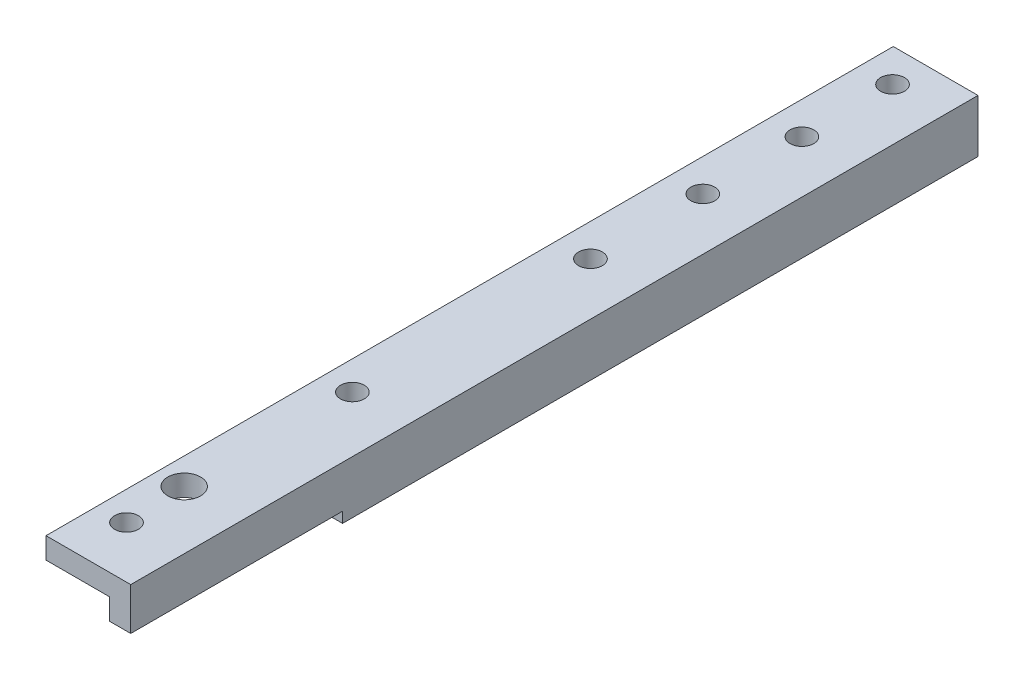
ISO-10303-21;
HEADER;
FILE_DESCRIPTION(('STEP AP214'),'2;1');
FILE_NAME('part.step','',(''),(''),'','','');
FILE_SCHEMA(('AUTOMOTIVE_DESIGN { 1 0 10303 214 1 1 1 1 }'));
ENDSEC;
DATA;
#1=APPLICATION_CONTEXT('core data for automotive mechanical design processes');
#2=APPLICATION_PROTOCOL_DEFINITION('international standard','automotive_design',2000,#1);
#3=PRODUCT_CONTEXT('',#1,'mechanical');
#4=PRODUCT('Part','Part','',(#3));
#5=PRODUCT_RELATED_PRODUCT_CATEGORY('part','',(#4));
#6=PRODUCT_DEFINITION_FORMATION('','',#4);
#7=PRODUCT_DEFINITION_CONTEXT('part definition',#1,'design');
#8=PRODUCT_DEFINITION('design','',#6,#7);
#9=PRODUCT_DEFINITION_SHAPE('','',#8);
#10=(LENGTH_UNIT() NAMED_UNIT(*) SI_UNIT(.MILLI.,.METRE.));
#11=(NAMED_UNIT(*) PLANE_ANGLE_UNIT() SI_UNIT($,.RADIAN.));
#12=(NAMED_UNIT(*) SI_UNIT($,.STERADIAN.) SOLID_ANGLE_UNIT());
#13=UNCERTAINTY_MEASURE_WITH_UNIT(LENGTH_MEASURE(1.E-05),#10,'distance_accuracy_value','');
#14=(GEOMETRIC_REPRESENTATION_CONTEXT(3) GLOBAL_UNCERTAINTY_ASSIGNED_CONTEXT((#13)) GLOBAL_UNIT_ASSIGNED_CONTEXT((#10,
#11,#12)) REPRESENTATION_CONTEXT('',''));
#15=CARTESIAN_POINT('',(0.,0.,0.));
#16=DIRECTION('',(0.,0.,1.));
#17=DIRECTION('',(1.,0.,0.));
#18=AXIS2_PLACEMENT_3D('',#15,#16,#17);
#19=CARTESIAN_POINT('',(4.,-4.,160.));
#20=DIRECTION('',(0.,1.,0.));
#21=DIRECTION('',(0.,0.,1.));
#22=AXIS2_PLACEMENT_3D('',#19,#20,#21);
#23=PLANE('',#22);
#24=CARTESIAN_POINT('',(9.00000000001513,-4.,138.89793195105));
#25=DIRECTION('',(0.,-1.,0.));
#26=DIRECTION('',(0.,0.,-1.));
#27=AXIS2_PLACEMENT_3D('',#24,#25,#26);
#28=CIRCLE('',#27,3.1);
#29=CARTESIAN_POINT('',(9.00000000001513,-4.,135.79793195105));
#30=VERTEX_POINT('',#29);
#31=EDGE_CURVE('E204',#30,#30,#28,.T.);
#32=ORIENTED_EDGE('',*,*,#31,.F.);
#33=EDGE_LOOP('',(#32));
#34=FACE_BOUND('',#33,.T.);
#35=CARTESIAN_POINT('',(10.1289115033545,-4.,6.26728637477271));
#36=DIRECTION('',(0.,-1.,0.));
#37=DIRECTION('',(0.,0.,-1.));
#38=AXIS2_PLACEMENT_3D('',#35,#36,#37);
#39=CIRCLE('',#38,2.24999999999999);
#40=CARTESIAN_POINT('',(10.1289115033545,-4.,4.01728637477273));
#41=VERTEX_POINT('',#40);
#42=EDGE_CURVE('E201',#41,#41,#39,.T.);
#43=ORIENTED_EDGE('',*,*,#42,.F.);
#44=EDGE_LOOP('',(#43));
#45=FACE_BOUND('',#44,.T.);
#46=CARTESIAN_POINT('',(10.1289115033545,-4.,23.3815670297532));
#47=DIRECTION('',(0.,-1.,0.));
#48=DIRECTION('',(0.,0.,-1.));
#49=AXIS2_PLACEMENT_3D('',#46,#47,#48);
#50=CIRCLE('',#49,2.24999999999999);
#51=CARTESIAN_POINT('',(10.1289115033545,-4.,21.1315670297532));
#52=VERTEX_POINT('',#51);
#53=EDGE_CURVE('E195',#52,#52,#50,.T.);
#54=ORIENTED_EDGE('',*,*,#53,.F.);
#55=EDGE_LOOP('',(#54));
#56=FACE_BOUND('',#55,.T.);
#57=CARTESIAN_POINT('',(10.1289115033545,-4.,42.0931805458651));
#58=DIRECTION('',(0.,-1.,0.));
#59=DIRECTION('',(0.,0.,-1.));
#60=AXIS2_PLACEMENT_3D('',#57,#58,#59);
#61=CIRCLE('',#60,2.24999999999999);
#62=CARTESIAN_POINT('',(10.1289115033545,-4.,39.8431805458652));
#63=VERTEX_POINT('',#62);
#64=EDGE_CURVE('E189',#63,#63,#61,.T.);
#65=ORIENTED_EDGE('',*,*,#64,.F.);
#66=EDGE_LOOP('',(#65));
#67=FACE_BOUND('',#66,.T.);
#68=CARTESIAN_POINT('',(10.1289115033545,-4.,63.3148885580409));
#69=DIRECTION('',(0.,-1.,0.));
#70=DIRECTION('',(0.,0.,-1.));
#71=AXIS2_PLACEMENT_3D('',#68,#69,#70);
#72=CIRCLE('',#71,2.24999999999999);
#73=CARTESIAN_POINT('',(10.1289115033545,-4.,61.0648885580409));
#74=VERTEX_POINT('',#73);
#75=EDGE_CURVE('E183',#74,#74,#72,.T.);
#76=ORIENTED_EDGE('',*,*,#75,.F.);
#77=EDGE_LOOP('',(#76));
#78=FACE_BOUND('',#77,.T.);
#79=CARTESIAN_POINT('',(9.44434027715525,-4.,107.583827852257));
#80=DIRECTION('',(0.,-1.,0.));
#81=DIRECTION('',(0.,0.,-1.));
#82=AXIS2_PLACEMENT_3D('',#79,#80,#81);
#83=CIRCLE('',#82,2.24999999999999);
#84=CARTESIAN_POINT('',(9.44434027715525,-4.,105.333827852257));
#85=VERTEX_POINT('',#84);
#86=EDGE_CURVE('E177',#85,#85,#83,.T.);
#87=ORIENTED_EDGE('',*,*,#86,.F.);
#88=EDGE_LOOP('',(#87));
#89=FACE_BOUND('',#88,.T.);
#90=DIRECTION('',(1.,0.,0.));
#91=VECTOR('',#90,1.);
#92=CARTESIAN_POINT('',(4.,-4.,0.));
#93=LINE('',#92,#91);
#94=CARTESIAN_POINT('',(4.,-4.,0.));
#95=VERTEX_POINT('',#94);
#96=CARTESIAN_POINT('',(16.,-4.,0.));
#97=VERTEX_POINT('',#96);
#98=EDGE_CURVE('E86',#95,#97,#93,.T.);
#99=ORIENTED_EDGE('',*,*,#98,.T.);
#100=DIRECTION('',(0.,0.,-1.));
#101=VECTOR('',#100,1.);
#102=CARTESIAN_POINT('',(16.,-4.,160.));
#103=LINE('',#102,#101);
#104=CARTESIAN_POINT('',(16.,-4.,160.));
#105=VERTEX_POINT('',#104);
#106=EDGE_CURVE('E141',#105,#97,#103,.T.);
#107=ORIENTED_EDGE('',*,*,#106,.F.);
#108=DIRECTION('',(1.,0.,0.));
#109=VECTOR('',#108,1.);
#110=CARTESIAN_POINT('',(4.,-4.,160.));
#111=LINE('',#110,#109);
#112=CARTESIAN_POINT('',(4.,-4.,160.));
#113=VERTEX_POINT('',#112);
#114=EDGE_CURVE('E60',#113,#105,#111,.T.);
#115=ORIENTED_EDGE('',*,*,#114,.F.);
#116=DIRECTION('',(0.,0.,-1.));
#117=VECTOR('',#116,1.);
#118=CARTESIAN_POINT('',(4.,-4.,160.));
#119=LINE('',#118,#117);
#120=EDGE_CURVE('E139',#113,#95,#119,.T.);
#121=ORIENTED_EDGE('',*,*,#120,.T.);
#122=EDGE_LOOP('',(#99,#107,#115,#121));
#123=FACE_BOUND('',#122,.T.);
#124=CARTESIAN_POINT('',(9.44434027715525,-4.,150.244789298313));
#125=DIRECTION('',(0.,-1.,0.));
#126=DIRECTION('',(0.,0.,-1.));
#127=AXIS2_PLACEMENT_3D('',#124,#125,#126);
#128=CIRCLE('',#127,2.24999999999999);
#129=CARTESIAN_POINT('',(9.44434027715525,-4.,147.994789298313));
#130=VERTEX_POINT('',#129);
#131=EDGE_CURVE('E171',#130,#130,#128,.T.);
#132=ORIENTED_EDGE('',*,*,#131,.F.);
#133=EDGE_LOOP('',(#132));
#134=FACE_BOUND('',#133,.T.);
#135=ADVANCED_FACE('F35',(#34,#45,#56,#67,#78,#89,#123,#134),#23,.F.);
#136=CARTESIAN_POINT('',(16.,-4.,160.));
#137=DIRECTION('',(1.,0.,0.));
#138=DIRECTION('',(0.,0.,-1.));
#139=AXIS2_PLACEMENT_3D('',#136,#137,#138);
#140=PLANE('',#139);
#141=DIRECTION('',(0.,-1.,0.));
#142=VECTOR('',#141,1.);
#143=CARTESIAN_POINT('',(16.,-9.99999999999998,120.));
#144=LINE('',#143,#142);
#145=CARTESIAN_POINT('',(16.,-8.00000000000024,120.));
#146=VERTEX_POINT('',#145);
#147=CARTESIAN_POINT('',(16.,-10.,120.));
#148=VERTEX_POINT('',#147);
#149=EDGE_CURVE('E115',#146,#148,#144,.T.);
#150=ORIENTED_EDGE('',*,*,#149,.F.);
#151=DIRECTION('',(0.,0.,-1.));
#152=VECTOR('',#151,1.);
#153=CARTESIAN_POINT('',(16.,-8.00000000000026,120.));
#154=LINE('',#153,#152);
#155=CARTESIAN_POINT('',(16.,-8.00000000000026,160.));
#156=VERTEX_POINT('',#155);
#157=EDGE_CURVE('E155',#156,#146,#154,.T.);
#158=ORIENTED_EDGE('',*,*,#157,.F.);
#159=DIRECTION('',(0.,-1.,0.));
#160=VECTOR('',#159,1.);
#161=CARTESIAN_POINT('',(16.,-4.,160.));
#162=LINE('',#161,#160);
#163=EDGE_CURVE('E144',#105,#156,#162,.T.);
#164=ORIENTED_EDGE('',*,*,#163,.F.);
#165=ORIENTED_EDGE('',*,*,#106,.T.);
#166=DIRECTION('',(0.,-1.,0.));
#167=VECTOR('',#166,1.);
#168=CARTESIAN_POINT('',(16.,-4.,0.));
#169=LINE('',#168,#167);
#170=CARTESIAN_POINT('',(16.,-10.,0.));
#171=VERTEX_POINT('',#170);
#172=EDGE_CURVE('E152',#97,#171,#169,.T.);
#173=ORIENTED_EDGE('',*,*,#172,.T.);
#174=DIRECTION('',(0.,0.,-1.));
#175=VECTOR('',#174,1.);
#176=CARTESIAN_POINT('',(16.,-10.,160.));
#177=LINE('',#176,#175);
#178=EDGE_CURVE('E11',#148,#171,#177,.T.);
#179=ORIENTED_EDGE('',*,*,#178,.F.);
#180=EDGE_LOOP('',(#150,#158,#164,#165,#173,#179));
#181=FACE_BOUND('',#180,.T.);
#182=ADVANCED_FACE('F37',(#181),#140,.F.);
#183=CARTESIAN_POINT('',(16.,-10.,160.));
#184=DIRECTION('',(0.,1.,0.));
#185=DIRECTION('',(0.,0.,1.));
#186=AXIS2_PLACEMENT_3D('',#183,#184,#185);
#187=PLANE('',#186);
#188=DIRECTION('',(0.,0.,-1.));
#189=VECTOR('',#188,1.);
#190=CARTESIAN_POINT('',(20.,-10.,160.));
#191=LINE('',#190,#189);
#192=CARTESIAN_POINT('',(20.,-10.,120.));
#193=VERTEX_POINT('',#192);
#194=CARTESIAN_POINT('',(20.,-10.,0.));
#195=VERTEX_POINT('',#194);
#196=EDGE_CURVE('E44',#193,#195,#191,.T.);
#197=ORIENTED_EDGE('',*,*,#196,.F.);
#198=DIRECTION('',(1.,0.,0.));
#199=VECTOR('',#198,1.);
#200=CARTESIAN_POINT('',(-24.0499687890016,-9.99999999999998,120.));
#201=LINE('',#200,#199);
#202=EDGE_CURVE('E109',#148,#193,#201,.T.);
#203=ORIENTED_EDGE('',*,*,#202,.F.);
#204=ORIENTED_EDGE('',*,*,#178,.T.);
#205=DIRECTION('',(1.,0.,0.));
#206=VECTOR('',#205,1.);
#207=CARTESIAN_POINT('',(16.,-10.,0.));
#208=LINE('',#207,#206);
#209=EDGE_CURVE('E129',#171,#195,#208,.T.);
#210=ORIENTED_EDGE('',*,*,#209,.T.);
#211=EDGE_LOOP('',(#197,#203,#204,#210));
#212=FACE_BOUND('',#211,.T.);
#213=ADVANCED_FACE('F127',(#212),#187,.F.);
#214=CARTESIAN_POINT('',(20.,0.,160.));
#215=DIRECTION('',(-1.,0.,0.));
#216=DIRECTION('',(0.,-1.,0.));
#217=AXIS2_PLACEMENT_3D('',#214,#215,#216);
#218=PLANE('',#217);
#219=DIRECTION('',(0.,1.,0.));
#220=VECTOR('',#219,1.);
#221=CARTESIAN_POINT('',(20.,0.,160.));
#222=LINE('',#221,#220);
#223=CARTESIAN_POINT('',(20.,-8.00000000000026,160.));
#224=VERTEX_POINT('',#223);
#225=CARTESIAN_POINT('',(20.,0.,160.));
#226=VERTEX_POINT('',#225);
#227=EDGE_CURVE('E92',#224,#226,#222,.T.);
#228=ORIENTED_EDGE('',*,*,#227,.F.);
#229=DIRECTION('',(0.,0.,1.));
#230=VECTOR('',#229,1.);
#231=CARTESIAN_POINT('',(20.,-8.00000000000026,120.));
#232=LINE('',#231,#230);
#233=CARTESIAN_POINT('',(20.,-8.00000000000026,120.));
#234=VERTEX_POINT('',#233);
#235=EDGE_CURVE('E51',#234,#224,#232,.T.);
#236=ORIENTED_EDGE('',*,*,#235,.F.);
#237=DIRECTION('',(0.,1.,0.));
#238=VECTOR('',#237,1.);
#239=CARTESIAN_POINT('',(20.,-10.,120.));
#240=LINE('',#239,#238);
#241=EDGE_CURVE('E113',#193,#234,#240,.T.);
#242=ORIENTED_EDGE('',*,*,#241,.F.);
#243=ORIENTED_EDGE('',*,*,#196,.T.);
#244=DIRECTION('',(0.,1.,0.));
#245=VECTOR('',#244,1.);
#246=CARTESIAN_POINT('',(20.,0.,0.));
#247=LINE('',#246,#245);
#248=CARTESIAN_POINT('',(20.,0.,0.));
#249=VERTEX_POINT('',#248);
#250=EDGE_CURVE('E149',#195,#249,#247,.T.);
#251=ORIENTED_EDGE('',*,*,#250,.T.);
#252=DIRECTION('',(0.,0.,-1.));
#253=VECTOR('',#252,1.);
#254=CARTESIAN_POINT('',(20.,0.,160.));
#255=LINE('',#254,#253);
#256=EDGE_CURVE('E131',#226,#249,#255,.T.);
#257=ORIENTED_EDGE('',*,*,#256,.F.);
#258=EDGE_LOOP('',(#228,#236,#242,#243,#251,#257));
#259=FACE_BOUND('',#258,.T.);
#260=ADVANCED_FACE('F122',(#259),#218,.F.);
#261=CARTESIAN_POINT('',(16.,0.,160.));
#262=DIRECTION('',(0.,-1.,0.));
#263=DIRECTION('',(1.,0.,0.));
#264=AXIS2_PLACEMENT_3D('',#261,#262,#263);
#265=PLANE('',#264);
#266=CARTESIAN_POINT('',(9.00000000001513,0.,138.89793195105));
#267=DIRECTION('',(0.,-1.,0.));
#268=DIRECTION('',(1.,0.,0.));
#269=AXIS2_PLACEMENT_3D('',#266,#267,#268);
#270=CIRCLE('',#269,3.1);
#271=CARTESIAN_POINT('',(12.1000000000151,0.,138.89793195105));
#272=VERTEX_POINT('',#271);
#273=EDGE_CURVE('E39',#272,#272,#270,.T.);
#274=ORIENTED_EDGE('',*,*,#273,.T.);
#275=EDGE_LOOP('',(#274));
#276=FACE_BOUND('',#275,.T.);
#277=CARTESIAN_POINT('',(10.1289115033545,0.,6.26728637477271));
#278=DIRECTION('',(0.,-1.,0.));
#279=DIRECTION('',(0.,0.,-1.));
#280=AXIS2_PLACEMENT_3D('',#277,#278,#279);
#281=CIRCLE('',#280,2.25);
#282=CARTESIAN_POINT('',(10.1289115033545,0.,4.01728637477272));
#283=VERTEX_POINT('',#282);
#284=EDGE_CURVE('E198',#283,#283,#281,.T.);
#285=ORIENTED_EDGE('',*,*,#284,.T.);
#286=EDGE_LOOP('',(#285));
#287=FACE_BOUND('',#286,.T.);
#288=CARTESIAN_POINT('',(10.1289115033545,0.,23.3815670297532));
#289=DIRECTION('',(0.,-1.,0.));
#290=DIRECTION('',(0.,0.,-1.));
#291=AXIS2_PLACEMENT_3D('',#288,#289,#290);
#292=CIRCLE('',#291,2.25);
#293=CARTESIAN_POINT('',(10.1289115033545,0.,21.1315670297532));
#294=VERTEX_POINT('',#293);
#295=EDGE_CURVE('E192',#294,#294,#292,.T.);
#296=ORIENTED_EDGE('',*,*,#295,.T.);
#297=EDGE_LOOP('',(#296));
#298=FACE_BOUND('',#297,.T.);
#299=CARTESIAN_POINT('',(10.1289115033545,0.,42.0931805458651));
#300=DIRECTION('',(0.,-1.,0.));
#301=DIRECTION('',(0.,0.,-1.));
#302=AXIS2_PLACEMENT_3D('',#299,#300,#301);
#303=CIRCLE('',#302,2.25);
#304=CARTESIAN_POINT('',(10.1289115033545,0.,39.8431805458652));
#305=VERTEX_POINT('',#304);
#306=EDGE_CURVE('E186',#305,#305,#303,.T.);
#307=ORIENTED_EDGE('',*,*,#306,.T.);
#308=EDGE_LOOP('',(#307));
#309=FACE_BOUND('',#308,.T.);
#310=CARTESIAN_POINT('',(10.1289115033545,0.,63.3148885580409));
#311=DIRECTION('',(0.,-1.,0.));
#312=DIRECTION('',(0.,0.,-1.));
#313=AXIS2_PLACEMENT_3D('',#310,#311,#312);
#314=CIRCLE('',#313,2.25);
#315=CARTESIAN_POINT('',(10.1289115033545,0.,61.0648885580409));
#316=VERTEX_POINT('',#315);
#317=EDGE_CURVE('E180',#316,#316,#314,.T.);
#318=ORIENTED_EDGE('',*,*,#317,.T.);
#319=EDGE_LOOP('',(#318));
#320=FACE_BOUND('',#319,.T.);
#321=CARTESIAN_POINT('',(9.44434027715525,0.,107.583827852257));
#322=DIRECTION('',(0.,-1.,0.));
#323=DIRECTION('',(0.,0.,-1.));
#324=AXIS2_PLACEMENT_3D('',#321,#322,#323);
#325=CIRCLE('',#324,2.25);
#326=CARTESIAN_POINT('',(9.44434027715525,0.,105.333827852257));
#327=VERTEX_POINT('',#326);
#328=EDGE_CURVE('E174',#327,#327,#325,.T.);
#329=ORIENTED_EDGE('',*,*,#328,.T.);
#330=EDGE_LOOP('',(#329));
#331=FACE_BOUND('',#330,.T.);
#332=CARTESIAN_POINT('',(9.44434027715525,0.,150.244789298313));
#333=DIRECTION('',(0.,-1.,0.));
#334=DIRECTION('',(0.,0.,-1.));
#335=AXIS2_PLACEMENT_3D('',#332,#333,#334);
#336=CIRCLE('',#335,2.25);
#337=CARTESIAN_POINT('',(9.44434027715525,0.,147.994789298313));
#338=VERTEX_POINT('',#337);
#339=EDGE_CURVE('E125',#338,#338,#336,.T.);
#340=ORIENTED_EDGE('',*,*,#339,.T.);
#341=EDGE_LOOP('',(#340));
#342=FACE_BOUND('',#341,.T.);
#343=DIRECTION('',(-1.,0.,0.));
#344=VECTOR('',#343,1.);
#345=CARTESIAN_POINT('',(16.,0.,0.));
#346=LINE('',#345,#344);
#347=CARTESIAN_POINT('',(4.,0.,0.));
#348=VERTEX_POINT('',#347);
#349=EDGE_CURVE('E147',#249,#348,#346,.T.);
#350=ORIENTED_EDGE('',*,*,#349,.T.);
#351=DIRECTION('',(0.,0.,-1.));
#352=VECTOR('',#351,1.);
#353=CARTESIAN_POINT('',(4.,0.,160.));
#354=LINE('',#353,#352);
#355=CARTESIAN_POINT('',(4.,0.,160.));
#356=VERTEX_POINT('',#355);
#357=EDGE_CURVE('E134',#356,#348,#354,.T.);
#358=ORIENTED_EDGE('',*,*,#357,.F.);
#359=DIRECTION('',(-1.,0.,0.));
#360=VECTOR('',#359,1.);
#361=CARTESIAN_POINT('',(16.,0.,160.));
#362=LINE('',#361,#360);
#363=EDGE_CURVE('E159',#226,#356,#362,.T.);
#364=ORIENTED_EDGE('',*,*,#363,.F.);
#365=ORIENTED_EDGE('',*,*,#256,.T.);
#366=EDGE_LOOP('',(#350,#358,#364,#365));
#367=FACE_BOUND('',#366,.T.);
#368=ADVANCED_FACE('F211',(#276,#287,#298,#309,#320,#331,#342,#367),#265,.F.);
#369=CARTESIAN_POINT('',(4.,0.,160.));
#370=DIRECTION('',(1.,0.,0.));
#371=DIRECTION('',(0.,1.,0.));
#372=AXIS2_PLACEMENT_3D('',#369,#370,#371);
#373=PLANE('',#372);
#374=DIRECTION('',(0.,-1.,0.));
#375=VECTOR('',#374,1.);
#376=CARTESIAN_POINT('',(4.,0.,0.));
#377=LINE('',#376,#375);
#378=EDGE_CURVE('E145',#348,#95,#377,.T.);
#379=ORIENTED_EDGE('',*,*,#378,.T.);
#380=ORIENTED_EDGE('',*,*,#120,.F.);
#381=DIRECTION('',(0.,-1.,0.));
#382=VECTOR('',#381,1.);
#383=CARTESIAN_POINT('',(4.,0.,160.));
#384=LINE('',#383,#382);
#385=EDGE_CURVE('E157',#356,#113,#384,.T.);
#386=ORIENTED_EDGE('',*,*,#385,.F.);
#387=ORIENTED_EDGE('',*,*,#357,.T.);
#388=EDGE_LOOP('',(#379,#380,#386,#387));
#389=FACE_BOUND('',#388,.T.);
#390=ADVANCED_FACE('F238',(#389),#373,.F.);
#391=CARTESIAN_POINT('',(0.,0.,160.));
#392=DIRECTION('',(0.,0.,1.));
#393=DIRECTION('',(1.,0.,0.));
#394=AXIS2_PLACEMENT_3D('',#391,#392,#393);
#395=PLANE('',#394);
#396=DIRECTION('',(1.,0.,0.));
#397=VECTOR('',#396,1.);
#398=CARTESIAN_POINT('',(-24.0499687890016,-8.00000000000025,160.));
#399=LINE('',#398,#397);
#400=EDGE_CURVE('E164',#156,#224,#399,.T.);
#401=ORIENTED_EDGE('',*,*,#400,.T.);
#402=ORIENTED_EDGE('',*,*,#227,.T.);
#403=ORIENTED_EDGE('',*,*,#363,.T.);
#404=ORIENTED_EDGE('',*,*,#385,.T.);
#405=ORIENTED_EDGE('',*,*,#114,.T.);
#406=ORIENTED_EDGE('',*,*,#163,.T.);
#407=EDGE_LOOP('',(#401,#402,#403,#404,#405,#406));
#408=FACE_BOUND('',#407,.T.);
#409=ADVANCED_FACE('F241',(#408),#395,.T.);
#410=CARTESIAN_POINT('',(0.,0.,0.));
#411=DIRECTION('',(0.,0.,1.));
#412=DIRECTION('',(1.,0.,0.));
#413=AXIS2_PLACEMENT_3D('',#410,#411,#412);
#414=PLANE('',#413);
#415=ORIENTED_EDGE('',*,*,#172,.F.);
#416=ORIENTED_EDGE('',*,*,#98,.F.);
#417=ORIENTED_EDGE('',*,*,#378,.F.);
#418=ORIENTED_EDGE('',*,*,#349,.F.);
#419=ORIENTED_EDGE('',*,*,#250,.F.);
#420=ORIENTED_EDGE('',*,*,#209,.F.);
#421=EDGE_LOOP('',(#415,#416,#417,#418,#419,#420));
#422=FACE_BOUND('',#421,.T.);
#423=ADVANCED_FACE('F236',(#422),#414,.F.);
#424=CARTESIAN_POINT('',(-24.0499687890016,-8.00000000000024,120.));
#425=DIRECTION('',(0.,1.,0.));
#426=DIRECTION('',(-1.,0.,0.));
#427=AXIS2_PLACEMENT_3D('',#424,#425,#426);
#428=PLANE('',#427);
#429=ORIENTED_EDGE('',*,*,#157,.T.);
#430=DIRECTION('',(1.,0.,0.));
#431=VECTOR('',#430,1.);
#432=CARTESIAN_POINT('',(-24.0499687890016,-8.00000000000024,120.));
#433=LINE('',#432,#431);
#434=EDGE_CURVE('E119',#146,#234,#433,.T.);
#435=ORIENTED_EDGE('',*,*,#434,.T.);
#436=ORIENTED_EDGE('',*,*,#235,.T.);
#437=ORIENTED_EDGE('',*,*,#400,.F.);
#438=EDGE_LOOP('',(#429,#435,#436,#437));
#439=FACE_BOUND('',#438,.T.);
#440=ADVANCED_FACE('F277',(#439),#428,.F.);
#441=CARTESIAN_POINT('',(-24.0499687890016,-9.99999999999998,120.));
#442=DIRECTION('',(0.,0.,-1.));
#443=DIRECTION('',(-1.,0.,0.));
#444=AXIS2_PLACEMENT_3D('',#441,#442,#443);
#445=PLANE('',#444);
#446=ORIENTED_EDGE('',*,*,#149,.T.);
#447=ORIENTED_EDGE('',*,*,#202,.T.);
#448=ORIENTED_EDGE('',*,*,#241,.T.);
#449=ORIENTED_EDGE('',*,*,#434,.F.);
#450=EDGE_LOOP('',(#446,#447,#448,#449));
#451=FACE_BOUND('',#450,.T.);
#452=ADVANCED_FACE('F111',(#451),#445,.F.);
#453=CARTESIAN_POINT('',(9.44434027715525,-4.,150.244789298313));
#454=DIRECTION('',(0.,-1.,0.));
#455=DIRECTION('',(0.,0.,-1.));
#456=AXIS2_PLACEMENT_3D('',#453,#454,#455);
#457=CYLINDRICAL_SURFACE('',#456,2.24999999999999);
#458=ORIENTED_EDGE('',*,*,#339,.F.);
#459=EDGE_LOOP('',(#458));
#460=FACE_BOUND('',#459,.T.);
#461=ORIENTED_EDGE('',*,*,#131,.T.);
#462=EDGE_LOOP('',(#461));
#463=FACE_BOUND('',#462,.T.);
#464=ADVANCED_FACE('F289',(#460,#463),#457,.F.);
#465=CARTESIAN_POINT('',(9.44434027715525,-4.,107.583827852257));
#466=DIRECTION('',(0.,-1.,0.));
#467=DIRECTION('',(0.,0.,-1.));
#468=AXIS2_PLACEMENT_3D('',#465,#466,#467);
#469=CYLINDRICAL_SURFACE('',#468,2.24999999999999);
#470=ORIENTED_EDGE('',*,*,#328,.F.);
#471=EDGE_LOOP('',(#470));
#472=FACE_BOUND('',#471,.T.);
#473=ORIENTED_EDGE('',*,*,#86,.T.);
#474=EDGE_LOOP('',(#473));
#475=FACE_BOUND('',#474,.T.);
#476=ADVANCED_FACE('F296',(#472,#475),#469,.F.);
#477=CARTESIAN_POINT('',(10.1289115033545,-4.,63.3148885580409));
#478=DIRECTION('',(0.,-1.,0.));
#479=DIRECTION('',(0.,0.,-1.));
#480=AXIS2_PLACEMENT_3D('',#477,#478,#479);
#481=CYLINDRICAL_SURFACE('',#480,2.24999999999999);
#482=ORIENTED_EDGE('',*,*,#317,.F.);
#483=EDGE_LOOP('',(#482));
#484=FACE_BOUND('',#483,.T.);
#485=ORIENTED_EDGE('',*,*,#75,.T.);
#486=EDGE_LOOP('',(#485));
#487=FACE_BOUND('',#486,.T.);
#488=ADVANCED_FACE('F304',(#484,#487),#481,.F.);
#489=CARTESIAN_POINT('',(10.1289115033545,-4.,42.0931805458651));
#490=DIRECTION('',(0.,-1.,0.));
#491=DIRECTION('',(0.,0.,-1.));
#492=AXIS2_PLACEMENT_3D('',#489,#490,#491);
#493=CYLINDRICAL_SURFACE('',#492,2.24999999999999);
#494=ORIENTED_EDGE('',*,*,#306,.F.);
#495=EDGE_LOOP('',(#494));
#496=FACE_BOUND('',#495,.T.);
#497=ORIENTED_EDGE('',*,*,#64,.T.);
#498=EDGE_LOOP('',(#497));
#499=FACE_BOUND('',#498,.T.);
#500=ADVANCED_FACE('F312',(#496,#499),#493,.F.);
#501=CARTESIAN_POINT('',(10.1289115033545,-4.,23.3815670297532));
#502=DIRECTION('',(0.,-1.,0.));
#503=DIRECTION('',(0.,0.,-1.));
#504=AXIS2_PLACEMENT_3D('',#501,#502,#503);
#505=CYLINDRICAL_SURFACE('',#504,2.24999999999999);
#506=ORIENTED_EDGE('',*,*,#295,.F.);
#507=EDGE_LOOP('',(#506));
#508=FACE_BOUND('',#507,.T.);
#509=ORIENTED_EDGE('',*,*,#53,.T.);
#510=EDGE_LOOP('',(#509));
#511=FACE_BOUND('',#510,.T.);
#512=ADVANCED_FACE('F221',(#508,#511),#505,.F.);
#513=CARTESIAN_POINT('',(10.1289115033545,-4.,6.26728637477271));
#514=DIRECTION('',(0.,-1.,0.));
#515=DIRECTION('',(0.,0.,-1.));
#516=AXIS2_PLACEMENT_3D('',#513,#514,#515);
#517=CYLINDRICAL_SURFACE('',#516,2.24999999999999);
#518=ORIENTED_EDGE('',*,*,#284,.F.);
#519=EDGE_LOOP('',(#518));
#520=FACE_BOUND('',#519,.T.);
#521=ORIENTED_EDGE('',*,*,#42,.T.);
#522=EDGE_LOOP('',(#521));
#523=FACE_BOUND('',#522,.T.);
#524=ADVANCED_FACE('F216',(#520,#523),#517,.F.);
#525=CARTESIAN_POINT('',(9.00000000001513,11.7681240867133,138.89793195105));
#526=DIRECTION('',(0.,-1.,0.));
#527=DIRECTION('',(0.,0.,-1.));
#528=AXIS2_PLACEMENT_3D('',#525,#526,#527);
#529=CYLINDRICAL_SURFACE('',#528,3.1);
#530=ORIENTED_EDGE('',*,*,#31,.T.);
#531=EDGE_LOOP('',(#530));
#532=FACE_BOUND('',#531,.T.);
#533=ORIENTED_EDGE('',*,*,#273,.F.);
#534=EDGE_LOOP('',(#533));
#535=FACE_BOUND('',#534,.T.);
#536=ADVANCED_FACE('F214',(#532,#535),#529,.F.);
#537=CLOSED_SHELL('',(#135,#182,#213,#260,#368,#390,#409,#423,#440,#452,#464,#476,#488,#500,
#512,#524,#536));
#538=MANIFOLD_SOLID_BREP('B2',#537);
#539=ADVANCED_BREP_SHAPE_REPRESENTATION('',(#18,#538),#14);
#540=SHAPE_DEFINITION_REPRESENTATION(#9,#539);
ENDSEC;
END-ISO-10303-21;
